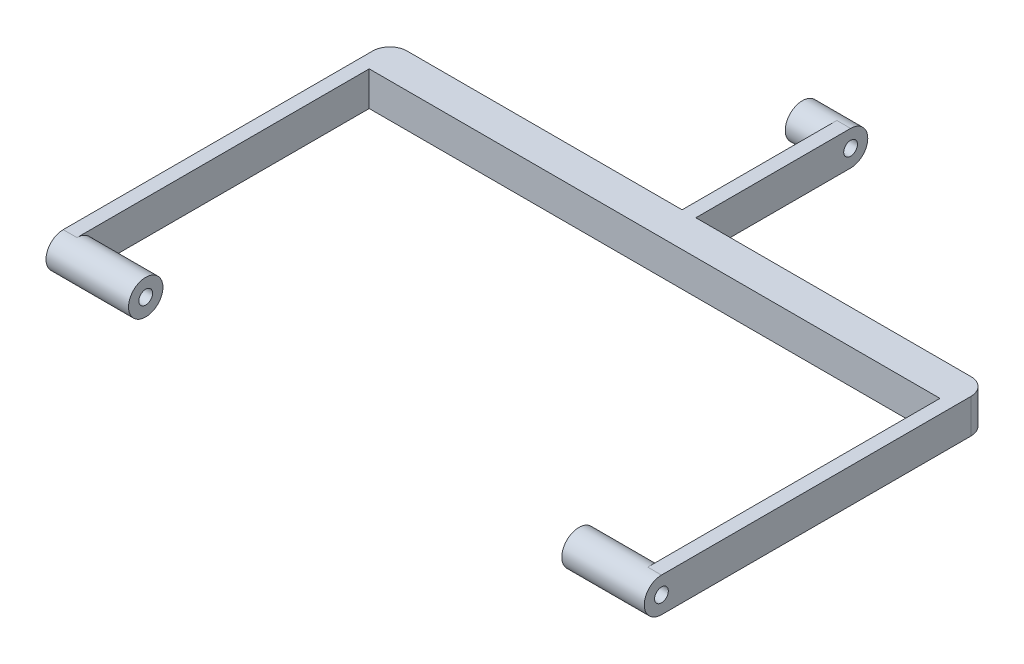
ISO-10303-21;
HEADER;
FILE_DESCRIPTION(('STEP AP214'),'2;1');
FILE_NAME('part.step','',(''),(''),'','','');
FILE_SCHEMA(('AUTOMOTIVE_DESIGN { 1 0 10303 214 1 1 1 1 }'));
ENDSEC;
DATA;
#1=APPLICATION_CONTEXT('core data for automotive mechanical design processes');
#2=APPLICATION_PROTOCOL_DEFINITION('international standard','automotive_design',2000,#1);
#3=PRODUCT_CONTEXT('',#1,'mechanical');
#4=PRODUCT('Part','Part','',(#3));
#5=PRODUCT_RELATED_PRODUCT_CATEGORY('part','',(#4));
#6=PRODUCT_DEFINITION_FORMATION('','',#4);
#7=PRODUCT_DEFINITION_CONTEXT('part definition',#1,'design');
#8=PRODUCT_DEFINITION('design','',#6,#7);
#9=PRODUCT_DEFINITION_SHAPE('','',#8);
#10=(LENGTH_UNIT() NAMED_UNIT(*) SI_UNIT(.MILLI.,.METRE.));
#11=(NAMED_UNIT(*) PLANE_ANGLE_UNIT() SI_UNIT($,.RADIAN.));
#12=(NAMED_UNIT(*) SI_UNIT($,.STERADIAN.) SOLID_ANGLE_UNIT());
#13=UNCERTAINTY_MEASURE_WITH_UNIT(LENGTH_MEASURE(1.E-05),#10,'distance_accuracy_value','');
#14=(GEOMETRIC_REPRESENTATION_CONTEXT(3) GLOBAL_UNCERTAINTY_ASSIGNED_CONTEXT((#13)) GLOBAL_UNIT_ASSIGNED_CONTEXT((#10,
#11,#12)) REPRESENTATION_CONTEXT('',''));
#15=CARTESIAN_POINT('',(0.,0.,0.));
#16=DIRECTION('',(0.,0.,1.));
#17=DIRECTION('',(1.,0.,0.));
#18=AXIS2_PLACEMENT_3D('',#15,#16,#17);
#19=CARTESIAN_POINT('',(-1.,0.,0.));
#20=DIRECTION('',(1.,0.,0.));
#21=DIRECTION('',(0.,0.,-1.));
#22=AXIS2_PLACEMENT_3D('',#19,#20,#21);
#23=PLANE('',#22);
#24=CARTESIAN_POINT('',(-1.,2.5,-25.));
#25=DIRECTION('',(-1.,0.,0.));
#26=DIRECTION('',(0.,0.,1.));
#27=AXIS2_PLACEMENT_3D('',#24,#25,#26);
#28=CIRCLE('',#27,2.5);
#29=CARTESIAN_POINT('',(-1.,0.,-25.));
#30=VERTEX_POINT('',#29);
#31=CARTESIAN_POINT('',(-1.,5.,-25.));
#32=VERTEX_POINT('',#31);
#33=EDGE_CURVE('E155',#30,#32,#28,.T.);
#34=ORIENTED_EDGE('',*,*,#33,.F.);
#35=DIRECTION('',(0.,0.,-1.));
#36=VECTOR('',#35,1.);
#37=CARTESIAN_POINT('',(-1.,0.,2.5));
#38=LINE('',#37,#36);
#39=CARTESIAN_POINT('',(-1.,0.,-2.5));
#40=VERTEX_POINT('',#39);
#41=EDGE_CURVE('E163',#40,#30,#38,.T.);
#42=ORIENTED_EDGE('',*,*,#41,.F.);
#43=DIRECTION('',(0.,1.,0.));
#44=VECTOR('',#43,1.);
#45=CARTESIAN_POINT('',(-1.,5.,-2.5));
#46=LINE('',#45,#44);
#47=CARTESIAN_POINT('',(-1.,5.,-2.5));
#48=VERTEX_POINT('',#47);
#49=EDGE_CURVE('E184',#40,#48,#46,.T.);
#50=ORIENTED_EDGE('',*,*,#49,.T.);
#51=DIRECTION('',(0.,0.,1.));
#52=VECTOR('',#51,1.);
#53=CARTESIAN_POINT('',(-1.,5.,2.5));
#54=LINE('',#53,#52);
#55=EDGE_CURVE('E169',#32,#48,#54,.T.);
#56=ORIENTED_EDGE('',*,*,#55,.F.);
#57=EDGE_LOOP('',(#34,#42,#50,#56));
#58=FACE_BOUND('',#57,.T.);
#59=ADVANCED_FACE('F33',(#58),#23,.F.);
#60=CARTESIAN_POINT('',(-43.5,5.,-2.5));
#61=DIRECTION('',(0.,0.,1.));
#62=DIRECTION('',(1.,0.,0.));
#63=AXIS2_PLACEMENT_3D('',#60,#61,#62);
#64=PLANE('',#63);
#65=ORIENTED_EDGE('',*,*,#49,.F.);
#66=DIRECTION('',(-1.,0.,0.));
#67=VECTOR('',#66,1.);
#68=CARTESIAN_POINT('',(-43.5,0.,-2.5));
#69=LINE('',#68,#67);
#70=CARTESIAN_POINT('',(-41.,0.,-2.5));
#71=VERTEX_POINT('',#70);
#72=EDGE_CURVE('E166',#40,#71,#69,.T.);
#73=ORIENTED_EDGE('',*,*,#72,.T.);
#74=DIRECTION('',(0.,-1.,0.));
#75=VECTOR('',#74,1.);
#76=CARTESIAN_POINT('',(-41.,5.,-2.5));
#77=LINE('',#76,#75);
#78=CARTESIAN_POINT('',(-41.,5.,-2.5));
#79=VERTEX_POINT('',#78);
#80=EDGE_CURVE('E272',#71,#79,#77,.F.);
#81=ORIENTED_EDGE('',*,*,#80,.T.);
#82=DIRECTION('',(-1.,0.,0.));
#83=VECTOR('',#82,1.);
#84=CARTESIAN_POINT('',(-43.5,5.,-2.5));
#85=LINE('',#84,#83);
#86=EDGE_CURVE('E236',#48,#79,#85,.T.);
#87=ORIENTED_EDGE('',*,*,#86,.F.);
#88=EDGE_LOOP('',(#65,#73,#81,#87));
#89=FACE_BOUND('',#88,.T.);
#90=ADVANCED_FACE('F350',(#89),#64,.F.);
#91=CARTESIAN_POINT('',(-41.5,5.,-2.5));
#92=DIRECTION('',(-1.,0.,0.));
#93=DIRECTION('',(0.,0.,1.));
#94=AXIS2_PLACEMENT_3D('',#91,#92,#93);
#95=PLANE('',#94);
#96=CARTESIAN_POINT('',(-41.5,2.5,45.));
#97=DIRECTION('',(1.,0.,0.));
#98=DIRECTION('',(0.,0.,-1.));
#99=AXIS2_PLACEMENT_3D('',#96,#97,#98);
#100=CIRCLE('',#99,2.5);
#101=CARTESIAN_POINT('',(-41.5,0.,45.));
#102=VERTEX_POINT('',#101);
#103=CARTESIAN_POINT('',(-41.5,5.,45.));
#104=VERTEX_POINT('',#103);
#105=EDGE_CURVE('E216',#102,#104,#100,.T.);
#106=ORIENTED_EDGE('',*,*,#105,.F.);
#107=DIRECTION('',(0.,0.,-1.));
#108=VECTOR('',#107,1.);
#109=CARTESIAN_POINT('',(-41.5,0.,-2.5));
#110=LINE('',#109,#108);
#111=CARTESIAN_POINT('',(-41.5,0.,2.5));
#112=VERTEX_POINT('',#111);
#113=EDGE_CURVE('E228',#102,#112,#110,.T.);
#114=ORIENTED_EDGE('',*,*,#113,.T.);
#115=DIRECTION('',(0.,1.,0.));
#116=VECTOR('',#115,1.);
#117=CARTESIAN_POINT('',(-41.5,5.,2.5));
#118=LINE('',#117,#116);
#119=CARTESIAN_POINT('',(-41.5,5.,2.5));
#120=VERTEX_POINT('',#119);
#121=EDGE_CURVE('E227',#112,#120,#118,.T.);
#122=ORIENTED_EDGE('',*,*,#121,.T.);
#123=DIRECTION('',(0.,0.,-1.));
#124=VECTOR('',#123,1.);
#125=CARTESIAN_POINT('',(-41.5,5.,-2.5));
#126=LINE('',#125,#124);
#127=EDGE_CURVE('E225',#104,#120,#126,.T.);
#128=ORIENTED_EDGE('',*,*,#127,.F.);
#129=EDGE_LOOP('',(#106,#114,#122,#128));
#130=FACE_BOUND('',#129,.T.);
#131=ADVANCED_FACE('F334',(#130),#95,.F.);
#132=CARTESIAN_POINT('',(-43.5,5.,2.5));
#133=DIRECTION('',(0.,0.,-1.));
#134=DIRECTION('',(-1.,0.,0.));
#135=AXIS2_PLACEMENT_3D('',#132,#133,#134);
#136=PLANE('',#135);
#137=DIRECTION('',(0.,1.,0.));
#138=VECTOR('',#137,1.);
#139=CARTESIAN_POINT('',(41.5,5.,2.5));
#140=LINE('',#139,#138);
#141=CARTESIAN_POINT('',(41.5,0.,2.5));
#142=VERTEX_POINT('',#141);
#143=CARTESIAN_POINT('',(41.5,5.,2.5));
#144=VERTEX_POINT('',#143);
#145=EDGE_CURVE('E206',#142,#144,#140,.T.);
#146=ORIENTED_EDGE('',*,*,#145,.T.);
#147=DIRECTION('',(1.,0.,0.));
#148=VECTOR('',#147,1.);
#149=CARTESIAN_POINT('',(-43.5,5.,2.5));
#150=LINE('',#149,#148);
#151=EDGE_CURVE('E243',#120,#144,#150,.T.);
#152=ORIENTED_EDGE('',*,*,#151,.F.);
#153=ORIENTED_EDGE('',*,*,#121,.F.);
#154=DIRECTION('',(1.,0.,0.));
#155=VECTOR('',#154,1.);
#156=CARTESIAN_POINT('',(-43.5,0.,2.5));
#157=LINE('',#156,#155);
#158=EDGE_CURVE('E237',#112,#142,#157,.T.);
#159=ORIENTED_EDGE('',*,*,#158,.T.);
#160=EDGE_LOOP('',(#146,#152,#153,#159));
#161=FACE_BOUND('',#160,.T.);
#162=ADVANCED_FACE('F327',(#161),#136,.F.);
#163=CARTESIAN_POINT('',(43.5,5.,2.5));
#164=DIRECTION('',(-1.,0.,0.));
#165=DIRECTION('',(0.,0.,1.));
#166=AXIS2_PLACEMENT_3D('',#163,#164,#165);
#167=PLANE('',#166);
#168=CARTESIAN_POINT('',(43.5,2.5,45.));
#169=DIRECTION('',(1.,0.,0.));
#170=DIRECTION('',(0.,0.,-1.));
#171=AXIS2_PLACEMENT_3D('',#168,#169,#170);
#172=CIRCLE('',#171,0.999999999999998);
#173=CARTESIAN_POINT('',(43.5,2.5,44.));
#174=VERTEX_POINT('',#173);
#175=EDGE_CURVE('E192',#174,#174,#172,.T.);
#176=ORIENTED_EDGE('',*,*,#175,.F.);
#177=EDGE_LOOP('',(#176));
#178=FACE_BOUND('',#177,.T.);
#179=DIRECTION('',(0.,0.,-1.));
#180=VECTOR('',#179,1.);
#181=CARTESIAN_POINT('',(43.5,0.,2.5));
#182=LINE('',#181,#180);
#183=CARTESIAN_POINT('',(43.5,0.,45.));
#184=VERTEX_POINT('',#183);
#185=CARTESIAN_POINT('',(43.5,0.,0.));
#186=VERTEX_POINT('',#185);
#187=EDGE_CURVE('E232',#184,#186,#182,.T.);
#188=ORIENTED_EDGE('',*,*,#187,.T.);
#189=DIRECTION('',(0.,-1.,0.));
#190=VECTOR('',#189,1.);
#191=CARTESIAN_POINT('',(43.5,5.,0.));
#192=LINE('',#191,#190);
#193=CARTESIAN_POINT('',(43.5,5.,0.));
#194=VERTEX_POINT('',#193);
#195=EDGE_CURVE('E283',#186,#194,#192,.F.);
#196=ORIENTED_EDGE('',*,*,#195,.T.);
#197=DIRECTION('',(0.,0.,-1.));
#198=VECTOR('',#197,1.);
#199=CARTESIAN_POINT('',(43.5,5.,2.5));
#200=LINE('',#199,#198);
#201=CARTESIAN_POINT('',(43.5,5.,45.));
#202=VERTEX_POINT('',#201);
#203=EDGE_CURVE('E233',#202,#194,#200,.T.);
#204=ORIENTED_EDGE('',*,*,#203,.F.);
#205=CARTESIAN_POINT('',(43.5,2.5,45.));
#206=DIRECTION('',(-1.,0.,0.));
#207=DIRECTION('',(0.,0.,1.));
#208=AXIS2_PLACEMENT_3D('',#205,#206,#207);
#209=CIRCLE('',#208,2.5);
#210=CARTESIAN_POINT('',(43.5,2.5,47.5));
#211=VERTEX_POINT('',#210);
#212=EDGE_CURVE('E266',#202,#211,#209,.F.);
#213=ORIENTED_EDGE('',*,*,#212,.T.);
#214=CARTESIAN_POINT('',(43.5,2.5,45.));
#215=DIRECTION('',(-1.,0.,0.));
#216=DIRECTION('',(0.,0.,1.));
#217=AXIS2_PLACEMENT_3D('',#214,#215,#216);
#218=CIRCLE('',#217,2.5);
#219=EDGE_CURVE('E268',#211,#184,#218,.F.);
#220=ORIENTED_EDGE('',*,*,#219,.T.);
#221=EDGE_LOOP('',(#188,#196,#204,#213,#220));
#222=FACE_BOUND('',#221,.T.);
#223=ADVANCED_FACE('F307',(#178,#222),#167,.F.);
#224=CARTESIAN_POINT('',(41.,0.,-2.5));
#225=VERTEX_POINT('',#224);
#226=CARTESIAN_POINT('',(1.,0.,-2.5));
#227=VERTEX_POINT('',#226);
#228=EDGE_CURVE('E248',#225,#227,#69,.T.);
#229=ORIENTED_EDGE('',*,*,#228,.T.);
#230=DIRECTION('',(0.,1.,0.));
#231=VECTOR('',#230,1.);
#232=CARTESIAN_POINT('',(1.,5.,-2.5));
#233=LINE('',#232,#231);
#234=CARTESIAN_POINT('',(1.,5.,-2.5));
#235=VERTEX_POINT('',#234);
#236=EDGE_CURVE('E188',#227,#235,#233,.T.);
#237=ORIENTED_EDGE('',*,*,#236,.T.);
#238=CARTESIAN_POINT('',(41.,5.,-2.5));
#239=VERTEX_POINT('',#238);
#240=EDGE_CURVE('E238',#239,#235,#85,.T.);
#241=ORIENTED_EDGE('',*,*,#240,.F.);
#242=DIRECTION('',(0.,-1.,0.));
#243=VECTOR('',#242,1.);
#244=CARTESIAN_POINT('',(41.,5.,-2.5));
#245=LINE('',#244,#243);
#246=EDGE_CURVE('E276',#239,#225,#245,.T.);
#247=ORIENTED_EDGE('',*,*,#246,.T.);
#248=EDGE_LOOP('',(#229,#237,#241,#247));
#249=FACE_BOUND('',#248,.T.);
#250=ADVANCED_FACE('F299',(#249),#64,.F.);
#251=CARTESIAN_POINT('',(-43.5,5.,2.5));
#252=DIRECTION('',(1.,0.,0.));
#253=DIRECTION('',(0.,0.,-1.));
#254=AXIS2_PLACEMENT_3D('',#251,#252,#253);
#255=PLANE('',#254);
#256=CARTESIAN_POINT('',(-43.5,2.5,45.));
#257=DIRECTION('',(1.,0.,0.));
#258=DIRECTION('',(0.,0.,-1.));
#259=AXIS2_PLACEMENT_3D('',#256,#257,#258);
#260=CIRCLE('',#259,0.999999999999998);
#261=CARTESIAN_POINT('',(-43.5,2.5,44.));
#262=VERTEX_POINT('',#261);
#263=EDGE_CURVE('E213',#262,#262,#260,.T.);
#264=ORIENTED_EDGE('',*,*,#263,.T.);
#265=EDGE_LOOP('',(#264));
#266=FACE_BOUND('',#265,.T.);
#267=DIRECTION('',(0.,0.,1.));
#268=VECTOR('',#267,1.);
#269=CARTESIAN_POINT('',(-43.5,5.,2.5));
#270=LINE('',#269,#268);
#271=CARTESIAN_POINT('',(-43.5,5.,0.));
#272=VERTEX_POINT('',#271);
#273=CARTESIAN_POINT('',(-43.5,5.,45.));
#274=VERTEX_POINT('',#273);
#275=EDGE_CURVE('E241',#272,#274,#270,.T.);
#276=ORIENTED_EDGE('',*,*,#275,.F.);
#277=DIRECTION('',(0.,-1.,0.));
#278=VECTOR('',#277,1.);
#279=CARTESIAN_POINT('',(-43.5,5.,0.));
#280=LINE('',#279,#278);
#281=CARTESIAN_POINT('',(-43.5,0.,0.));
#282=VERTEX_POINT('',#281);
#283=EDGE_CURVE('E159',#272,#282,#280,.T.);
#284=ORIENTED_EDGE('',*,*,#283,.T.);
#285=DIRECTION('',(0.,0.,1.));
#286=VECTOR('',#285,1.);
#287=CARTESIAN_POINT('',(-43.5,0.,2.5));
#288=LINE('',#287,#286);
#289=CARTESIAN_POINT('',(-43.5,0.,45.));
#290=VERTEX_POINT('',#289);
#291=EDGE_CURVE('E250',#282,#290,#288,.T.);
#292=ORIENTED_EDGE('',*,*,#291,.T.);
#293=CARTESIAN_POINT('',(-43.5,2.5,45.));
#294=DIRECTION('',(1.,0.,0.));
#295=DIRECTION('',(0.,0.,-1.));
#296=AXIS2_PLACEMENT_3D('',#293,#294,#295);
#297=CIRCLE('',#296,2.5);
#298=CARTESIAN_POINT('',(-43.5,2.5,47.5));
#299=VERTEX_POINT('',#298);
#300=EDGE_CURVE('E258',#290,#299,#297,.F.);
#301=ORIENTED_EDGE('',*,*,#300,.T.);
#302=CARTESIAN_POINT('',(-43.5,2.5,45.));
#303=DIRECTION('',(1.,0.,0.));
#304=DIRECTION('',(0.,0.,-1.));
#305=AXIS2_PLACEMENT_3D('',#302,#303,#304);
#306=CIRCLE('',#305,2.5);
#307=EDGE_CURVE('E255',#299,#274,#306,.F.);
#308=ORIENTED_EDGE('',*,*,#307,.T.);
#309=EDGE_LOOP('',(#276,#284,#292,#301,#308));
#310=FACE_BOUND('',#309,.T.);
#311=ADVANCED_FACE('F343',(#266,#310),#255,.F.);
#312=CARTESIAN_POINT('',(0.,5.,0.));
#313=DIRECTION('',(0.,-1.,0.));
#314=DIRECTION('',(0.,0.,-1.));
#315=AXIS2_PLACEMENT_3D('',#312,#313,#314);
#316=PLANE('',#315);
#317=DIRECTION('',(0.,0.,1.));
#318=VECTOR('',#317,1.);
#319=CARTESIAN_POINT('',(1.,5.,2.5));
#320=LINE('',#319,#318);
#321=CARTESIAN_POINT('',(1.,5.,-25.));
#322=VERTEX_POINT('',#321);
#323=EDGE_CURVE('E183',#322,#235,#320,.T.);
#324=ORIENTED_EDGE('',*,*,#323,.F.);
#325=DIRECTION('',(-1.,0.,0.));
#326=VECTOR('',#325,1.);
#327=CARTESIAN_POINT('',(0.,5.,-25.));
#328=LINE('',#327,#326);
#329=EDGE_CURVE('E11',#322,#32,#328,.T.);
#330=ORIENTED_EDGE('',*,*,#329,.T.);
#331=ORIENTED_EDGE('',*,*,#55,.T.);
#332=ORIENTED_EDGE('',*,*,#86,.T.);
#333=CARTESIAN_POINT('',(-41.,5.,0.));
#334=DIRECTION('',(0.,-1.,0.));
#335=DIRECTION('',(0.,0.,-1.));
#336=AXIS2_PLACEMENT_3D('',#333,#334,#335);
#337=CIRCLE('',#336,2.5);
#338=EDGE_CURVE('E285',#79,#272,#337,.F.);
#339=ORIENTED_EDGE('',*,*,#338,.T.);
#340=ORIENTED_EDGE('',*,*,#275,.T.);
#341=DIRECTION('',(1.,0.,0.));
#342=VECTOR('',#341,1.);
#343=CARTESIAN_POINT('',(0.,5.,45.));
#344=LINE('',#343,#342);
#345=EDGE_CURVE('E260',#274,#104,#344,.T.);
#346=ORIENTED_EDGE('',*,*,#345,.T.);
#347=ORIENTED_EDGE('',*,*,#127,.T.);
#348=ORIENTED_EDGE('',*,*,#151,.T.);
#349=DIRECTION('',(0.,0.,-1.));
#350=VECTOR('',#349,1.);
#351=CARTESIAN_POINT('',(41.5,5.,-2.5));
#352=LINE('',#351,#350);
#353=CARTESIAN_POINT('',(41.5,5.,45.));
#354=VERTEX_POINT('',#353);
#355=EDGE_CURVE('E203',#354,#144,#352,.T.);
#356=ORIENTED_EDGE('',*,*,#355,.F.);
#357=DIRECTION('',(-1.,0.,0.));
#358=VECTOR('',#357,1.);
#359=CARTESIAN_POINT('',(43.5,5.,45.));
#360=LINE('',#359,#358);
#361=EDGE_CURVE('E270',#354,#202,#360,.F.);
#362=ORIENTED_EDGE('',*,*,#361,.T.);
#363=ORIENTED_EDGE('',*,*,#203,.T.);
#364=CARTESIAN_POINT('',(41.,5.,0.));
#365=DIRECTION('',(0.,-1.,0.));
#366=DIRECTION('',(0.,0.,-1.));
#367=AXIS2_PLACEMENT_3D('',#364,#365,#366);
#368=CIRCLE('',#367,2.5);
#369=EDGE_CURVE('E287',#194,#239,#368,.F.);
#370=ORIENTED_EDGE('',*,*,#369,.T.);
#371=ORIENTED_EDGE('',*,*,#240,.T.);
#372=EDGE_LOOP('',(#324,#330,#331,#332,#339,#340,#346,#347,#348,#356,#362,#363,#370,#371));
#373=FACE_BOUND('',#372,.T.);
#374=ADVANCED_FACE('F293',(#373),#316,.F.);
#375=CARTESIAN_POINT('',(0.,0.,0.));
#376=DIRECTION('',(0.,-1.,0.));
#377=DIRECTION('',(0.,0.,-1.));
#378=AXIS2_PLACEMENT_3D('',#375,#376,#377);
#379=PLANE('',#378);
#380=ORIENTED_EDGE('',*,*,#41,.T.);
#381=DIRECTION('',(-1.,0.,0.));
#382=VECTOR('',#381,1.);
#383=CARTESIAN_POINT('',(1.,0.,-25.));
#384=LINE('',#383,#382);
#385=CARTESIAN_POINT('',(1.,0.,-25.));
#386=VERTEX_POINT('',#385);
#387=EDGE_CURVE('E150',#30,#386,#384,.F.);
#388=ORIENTED_EDGE('',*,*,#387,.T.);
#389=DIRECTION('',(0.,0.,-1.));
#390=VECTOR('',#389,1.);
#391=CARTESIAN_POINT('',(1.,0.,2.5));
#392=LINE('',#391,#390);
#393=EDGE_CURVE('E181',#227,#386,#392,.T.);
#394=ORIENTED_EDGE('',*,*,#393,.F.);
#395=ORIENTED_EDGE('',*,*,#228,.F.);
#396=CARTESIAN_POINT('',(41.,0.,0.));
#397=DIRECTION('',(0.,-1.,0.));
#398=DIRECTION('',(0.,0.,-1.));
#399=AXIS2_PLACEMENT_3D('',#396,#397,#398);
#400=CIRCLE('',#399,2.5);
#401=EDGE_CURVE('E281',#225,#186,#400,.T.);
#402=ORIENTED_EDGE('',*,*,#401,.T.);
#403=ORIENTED_EDGE('',*,*,#187,.F.);
#404=DIRECTION('',(-1.,0.,0.));
#405=VECTOR('',#404,1.);
#406=CARTESIAN_POINT('',(0.,0.,45.));
#407=LINE('',#406,#405);
#408=CARTESIAN_POINT('',(41.5,0.,45.));
#409=VERTEX_POINT('',#408);
#410=EDGE_CURVE('E262',#184,#409,#407,.T.);
#411=ORIENTED_EDGE('',*,*,#410,.T.);
#412=DIRECTION('',(0.,0.,-1.));
#413=VECTOR('',#412,1.);
#414=CARTESIAN_POINT('',(41.5,0.,-2.5));
#415=LINE('',#414,#413);
#416=EDGE_CURVE('E207',#409,#142,#415,.T.);
#417=ORIENTED_EDGE('',*,*,#416,.T.);
#418=ORIENTED_EDGE('',*,*,#158,.F.);
#419=ORIENTED_EDGE('',*,*,#113,.F.);
#420=DIRECTION('',(1.,0.,0.));
#421=VECTOR('',#420,1.);
#422=CARTESIAN_POINT('',(-43.5,0.,45.));
#423=LINE('',#422,#421);
#424=EDGE_CURVE('E245',#102,#290,#423,.F.);
#425=ORIENTED_EDGE('',*,*,#424,.T.);
#426=ORIENTED_EDGE('',*,*,#291,.F.);
#427=CARTESIAN_POINT('',(-41.,0.,0.));
#428=DIRECTION('',(0.,-1.,0.));
#429=DIRECTION('',(0.,0.,-1.));
#430=AXIS2_PLACEMENT_3D('',#427,#428,#429);
#431=CIRCLE('',#430,2.5);
#432=EDGE_CURVE('E279',#282,#71,#431,.T.);
#433=ORIENTED_EDGE('',*,*,#432,.T.);
#434=ORIENTED_EDGE('',*,*,#72,.F.);
#435=EDGE_LOOP('',(#380,#388,#394,#395,#402,#403,#411,#417,#418,#419,#425,#426,#433,#434));
#436=FACE_BOUND('',#435,.T.);
#437=ADVANCED_FACE('F164',(#436),#379,.T.);
#438=CARTESIAN_POINT('',(0.,2.5,45.));
#439=DIRECTION('',(1.,0.,0.));
#440=DIRECTION('',(0.,0.,-1.));
#441=AXIS2_PLACEMENT_3D('',#438,#439,#440);
#442=CYLINDRICAL_SURFACE('',#441,2.5);
#443=ORIENTED_EDGE('',*,*,#345,.F.);
#444=ORIENTED_EDGE('',*,*,#307,.F.);
#445=DIRECTION('',(1.,0.,0.));
#446=VECTOR('',#445,1.);
#447=CARTESIAN_POINT('',(-43.5,2.5,47.5));
#448=LINE('',#447,#446);
#449=CARTESIAN_POINT('',(-41.5,2.5,47.5));
#450=VERTEX_POINT('',#449);
#451=EDGE_CURVE('E222',#450,#299,#448,.F.);
#452=ORIENTED_EDGE('',*,*,#451,.F.);
#453=ORIENTED_EDGE('',*,*,#451,.T.);
#454=ORIENTED_EDGE('',*,*,#300,.F.);
#455=ORIENTED_EDGE('',*,*,#424,.F.);
#456=ORIENTED_EDGE('',*,*,#105,.T.);
#457=EDGE_LOOP('',(#443,#444,#452,#453,#454,#455,#456));
#458=FACE_BOUND('',#457,.T.);
#459=CARTESIAN_POINT('',(-31.5,2.5,45.));
#460=DIRECTION('',(1.,0.,0.));
#461=DIRECTION('',(0.,0.,-1.));
#462=AXIS2_PLACEMENT_3D('',#459,#460,#461);
#463=CIRCLE('',#462,2.5);
#464=CARTESIAN_POINT('',(-31.5,2.5,42.5));
#465=VERTEX_POINT('',#464);
#466=EDGE_CURVE('E219',#465,#465,#463,.T.);
#467=ORIENTED_EDGE('',*,*,#466,.F.);
#468=EDGE_LOOP('',(#467));
#469=FACE_BOUND('',#468,.T.);
#470=ADVANCED_FACE('F337',(#458,#469),#442,.T.);
#471=CARTESIAN_POINT('',(-31.5,2.5,45.));
#472=DIRECTION('',(1.,0.,0.));
#473=DIRECTION('',(0.,0.,-1.));
#474=AXIS2_PLACEMENT_3D('',#471,#472,#473);
#475=PLANE('',#474);
#476=CARTESIAN_POINT('',(-31.5,2.5,45.));
#477=DIRECTION('',(1.,0.,0.));
#478=DIRECTION('',(0.,0.,-1.));
#479=AXIS2_PLACEMENT_3D('',#476,#477,#478);
#480=CIRCLE('',#479,0.999999999999998);
#481=CARTESIAN_POINT('',(-31.5,2.5,44.));
#482=VERTEX_POINT('',#481);
#483=EDGE_CURVE('E212',#482,#482,#480,.T.);
#484=ORIENTED_EDGE('',*,*,#483,.F.);
#485=EDGE_LOOP('',(#484));
#486=FACE_BOUND('',#485,.T.);
#487=ORIENTED_EDGE('',*,*,#466,.T.);
#488=EDGE_LOOP('',(#487));
#489=FACE_BOUND('',#488,.T.);
#490=ADVANCED_FACE('F376',(#486,#489),#475,.T.);
#491=CARTESIAN_POINT('',(-43.5,2.5,45.));
#492=DIRECTION('',(1.,0.,0.));
#493=DIRECTION('',(0.,0.,-1.));
#494=AXIS2_PLACEMENT_3D('',#491,#492,#493);
#495=CYLINDRICAL_SURFACE('',#494,0.999999999999998);
#496=ORIENTED_EDGE('',*,*,#263,.F.);
#497=EDGE_LOOP('',(#496));
#498=FACE_BOUND('',#497,.T.);
#499=ORIENTED_EDGE('',*,*,#483,.T.);
#500=EDGE_LOOP('',(#499));
#501=FACE_BOUND('',#500,.T.);
#502=ADVANCED_FACE('F404',(#498,#501),#495,.F.);
#503=CARTESIAN_POINT('',(41.5,5.,-2.5));
#504=DIRECTION('',(-1.,0.,0.));
#505=DIRECTION('',(0.,0.,1.));
#506=AXIS2_PLACEMENT_3D('',#503,#504,#505);
#507=PLANE('',#506);
#508=CARTESIAN_POINT('',(41.5,2.5,45.));
#509=DIRECTION('',(1.,0.,0.));
#510=DIRECTION('',(0.,0.,-1.));
#511=AXIS2_PLACEMENT_3D('',#508,#509,#510);
#512=CIRCLE('',#511,2.5);
#513=EDGE_CURVE('E195',#409,#354,#512,.T.);
#514=ORIENTED_EDGE('',*,*,#513,.T.);
#515=ORIENTED_EDGE('',*,*,#355,.T.);
#516=ORIENTED_EDGE('',*,*,#145,.F.);
#517=ORIENTED_EDGE('',*,*,#416,.F.);
#518=EDGE_LOOP('',(#514,#515,#516,#517));
#519=FACE_BOUND('',#518,.T.);
#520=ADVANCED_FACE('F324',(#519),#507,.T.);
#521=CARTESIAN_POINT('',(43.5,2.5,45.));
#522=DIRECTION('',(1.,0.,0.));
#523=DIRECTION('',(0.,0.,-1.));
#524=AXIS2_PLACEMENT_3D('',#521,#522,#523);
#525=CYLINDRICAL_SURFACE('',#524,2.5);
#526=DIRECTION('',(-1.,0.,0.));
#527=VECTOR('',#526,1.);
#528=CARTESIAN_POINT('',(41.5,2.5,47.5));
#529=LINE('',#528,#527);
#530=CARTESIAN_POINT('',(41.5,2.5,47.5));
#531=VERTEX_POINT('',#530);
#532=EDGE_CURVE('E201',#211,#531,#529,.T.);
#533=ORIENTED_EDGE('',*,*,#532,.F.);
#534=ORIENTED_EDGE('',*,*,#212,.F.);
#535=ORIENTED_EDGE('',*,*,#361,.F.);
#536=ORIENTED_EDGE('',*,*,#513,.F.);
#537=ORIENTED_EDGE('',*,*,#410,.F.);
#538=ORIENTED_EDGE('',*,*,#219,.F.);
#539=ORIENTED_EDGE('',*,*,#532,.T.);
#540=EDGE_LOOP('',(#533,#534,#535,#536,#537,#538,#539));
#541=FACE_BOUND('',#540,.T.);
#542=CARTESIAN_POINT('',(31.5,2.5,45.));
#543=DIRECTION('',(1.,0.,0.));
#544=DIRECTION('',(0.,0.,-1.));
#545=AXIS2_PLACEMENT_3D('',#542,#543,#544);
#546=CIRCLE('',#545,2.5);
#547=CARTESIAN_POINT('',(31.5,2.5,42.5));
#548=VERTEX_POINT('',#547);
#549=EDGE_CURVE('E198',#548,#548,#546,.T.);
#550=ORIENTED_EDGE('',*,*,#549,.T.);
#551=EDGE_LOOP('',(#550));
#552=FACE_BOUND('',#551,.T.);
#553=ADVANCED_FACE('F317',(#541,#552),#525,.T.);
#554=CARTESIAN_POINT('',(31.5,2.5,45.));
#555=DIRECTION('',(-1.,0.,0.));
#556=DIRECTION('',(0.,0.,-1.));
#557=AXIS2_PLACEMENT_3D('',#554,#555,#556);
#558=PLANE('',#557);
#559=CARTESIAN_POINT('',(31.5,2.5,45.));
#560=DIRECTION('',(1.,0.,0.));
#561=DIRECTION('',(0.,0.,-1.));
#562=AXIS2_PLACEMENT_3D('',#559,#560,#561);
#563=CIRCLE('',#562,0.999999999999998);
#564=CARTESIAN_POINT('',(31.5,2.5,44.));
#565=VERTEX_POINT('',#564);
#566=EDGE_CURVE('E191',#565,#565,#563,.T.);
#567=ORIENTED_EDGE('',*,*,#566,.T.);
#568=EDGE_LOOP('',(#567));
#569=FACE_BOUND('',#568,.T.);
#570=ORIENTED_EDGE('',*,*,#549,.F.);
#571=EDGE_LOOP('',(#570));
#572=FACE_BOUND('',#571,.T.);
#573=ADVANCED_FACE('F379',(#569,#572),#558,.T.);
#574=CARTESIAN_POINT('',(43.5,2.5,45.));
#575=DIRECTION('',(-1.,0.,0.));
#576=DIRECTION('',(0.,0.,1.));
#577=AXIS2_PLACEMENT_3D('',#574,#575,#576);
#578=CYLINDRICAL_SURFACE('',#577,0.999999999999998);
#579=ORIENTED_EDGE('',*,*,#175,.T.);
#580=EDGE_LOOP('',(#579));
#581=FACE_BOUND('',#580,.T.);
#582=ORIENTED_EDGE('',*,*,#566,.F.);
#583=EDGE_LOOP('',(#582));
#584=FACE_BOUND('',#583,.T.);
#585=ADVANCED_FACE('F381',(#581,#584),#578,.F.);
#586=CARTESIAN_POINT('',(41.,5.,0.));
#587=DIRECTION('',(0.,-1.,0.));
#588=DIRECTION('',(0.,0.,-1.));
#589=AXIS2_PLACEMENT_3D('',#586,#587,#588);
#590=CYLINDRICAL_SURFACE('',#589,2.5);
#591=ORIENTED_EDGE('',*,*,#369,.F.);
#592=ORIENTED_EDGE('',*,*,#195,.F.);
#593=ORIENTED_EDGE('',*,*,#401,.F.);
#594=ORIENTED_EDGE('',*,*,#246,.F.);
#595=EDGE_LOOP('',(#591,#592,#593,#594));
#596=FACE_BOUND('',#595,.T.);
#597=ADVANCED_FACE('F311',(#596),#590,.T.);
#598=CARTESIAN_POINT('',(-41.,5.,0.));
#599=DIRECTION('',(0.,-1.,0.));
#600=DIRECTION('',(0.,0.,-1.));
#601=AXIS2_PLACEMENT_3D('',#598,#599,#600);
#602=CYLINDRICAL_SURFACE('',#601,2.5);
#603=ORIENTED_EDGE('',*,*,#338,.F.);
#604=ORIENTED_EDGE('',*,*,#80,.F.);
#605=ORIENTED_EDGE('',*,*,#432,.F.);
#606=ORIENTED_EDGE('',*,*,#283,.F.);
#607=EDGE_LOOP('',(#603,#604,#605,#606));
#608=FACE_BOUND('',#607,.T.);
#609=ADVANCED_FACE('F348',(#608),#602,.T.);
#610=CARTESIAN_POINT('',(1.,0.,0.));
#611=DIRECTION('',(1.,0.,0.));
#612=DIRECTION('',(0.,0.,-1.));
#613=AXIS2_PLACEMENT_3D('',#610,#611,#612);
#614=PLANE('',#613);
#615=CARTESIAN_POINT('',(1.,2.5,-25.));
#616=DIRECTION('',(1.,0.,0.));
#617=DIRECTION('',(0.,0.,-1.));
#618=AXIS2_PLACEMENT_3D('',#615,#616,#617);
#619=CIRCLE('',#618,1.00000000000001);
#620=CARTESIAN_POINT('',(1.,2.5,-26.));
#621=VERTEX_POINT('',#620);
#622=EDGE_CURVE('E174',#621,#621,#619,.T.);
#623=ORIENTED_EDGE('',*,*,#622,.F.);
#624=EDGE_LOOP('',(#623));
#625=FACE_BOUND('',#624,.T.);
#626=ORIENTED_EDGE('',*,*,#393,.T.);
#627=CARTESIAN_POINT('',(1.,2.5,-25.));
#628=DIRECTION('',(1.,0.,0.));
#629=DIRECTION('',(0.,0.,-1.));
#630=AXIS2_PLACEMENT_3D('',#627,#628,#629);
#631=CIRCLE('',#630,2.5);
#632=CARTESIAN_POINT('',(1.,2.5,-27.5));
#633=VERTEX_POINT('',#632);
#634=EDGE_CURVE('E42',#386,#633,#631,.T.);
#635=ORIENTED_EDGE('',*,*,#634,.T.);
#636=CARTESIAN_POINT('',(1.,2.5,-25.));
#637=DIRECTION('',(1.,0.,0.));
#638=DIRECTION('',(0.,0.,-1.));
#639=AXIS2_PLACEMENT_3D('',#636,#637,#638);
#640=CIRCLE('',#639,2.5);
#641=EDGE_CURVE('E50',#633,#322,#640,.T.);
#642=ORIENTED_EDGE('',*,*,#641,.T.);
#643=ORIENTED_EDGE('',*,*,#323,.T.);
#644=ORIENTED_EDGE('',*,*,#236,.F.);
#645=EDGE_LOOP('',(#626,#635,#642,#643,#644));
#646=FACE_BOUND('',#645,.T.);
#647=ADVANCED_FACE('F297',(#625,#646),#614,.T.);
#648=CARTESIAN_POINT('',(0.,2.5,-25.));
#649=DIRECTION('',(-1.,0.,0.));
#650=DIRECTION('',(0.,0.,1.));
#651=AXIS2_PLACEMENT_3D('',#648,#649,#650);
#652=CYLINDRICAL_SURFACE('',#651,2.5);
#653=ORIENTED_EDGE('',*,*,#329,.F.);
#654=ORIENTED_EDGE('',*,*,#641,.F.);
#655=DIRECTION('',(-1.,0.,0.));
#656=VECTOR('',#655,1.);
#657=CARTESIAN_POINT('',(1.,2.5,-27.5));
#658=LINE('',#657,#656);
#659=CARTESIAN_POINT('',(-1.,2.5,-27.5));
#660=VERTEX_POINT('',#659);
#661=EDGE_CURVE('E170',#660,#633,#658,.F.);
#662=ORIENTED_EDGE('',*,*,#661,.F.);
#663=ORIENTED_EDGE('',*,*,#661,.T.);
#664=ORIENTED_EDGE('',*,*,#634,.F.);
#665=ORIENTED_EDGE('',*,*,#387,.F.);
#666=ORIENTED_EDGE('',*,*,#33,.T.);
#667=EDGE_LOOP('',(#653,#654,#662,#663,#664,#665,#666));
#668=FACE_BOUND('',#667,.T.);
#669=CARTESIAN_POINT('',(-6.,2.5,-25.));
#670=DIRECTION('',(-1.,0.,0.));
#671=DIRECTION('',(0.,0.,1.));
#672=AXIS2_PLACEMENT_3D('',#669,#670,#671);
#673=CIRCLE('',#672,2.5);
#674=CARTESIAN_POINT('',(-6.,2.5,-22.5));
#675=VERTEX_POINT('',#674);
#676=EDGE_CURVE('E173',#675,#675,#673,.T.);
#677=ORIENTED_EDGE('',*,*,#676,.F.);
#678=EDGE_LOOP('',(#677));
#679=FACE_BOUND('',#678,.T.);
#680=ADVANCED_FACE('F35',(#668,#679),#652,.T.);
#681=CARTESIAN_POINT('',(-6.,2.5,-25.));
#682=DIRECTION('',(-1.,0.,0.));
#683=DIRECTION('',(0.,0.,1.));
#684=AXIS2_PLACEMENT_3D('',#681,#682,#683);
#685=PLANE('',#684);
#686=CARTESIAN_POINT('',(-6.,2.5,-25.));
#687=DIRECTION('',(-1.,0.,0.));
#688=DIRECTION('',(0.,0.,1.));
#689=AXIS2_PLACEMENT_3D('',#686,#687,#688);
#690=CIRCLE('',#689,1.00000000000001);
#691=CARTESIAN_POINT('',(-6.,2.5,-24.));
#692=VERTEX_POINT('',#691);
#693=EDGE_CURVE('E37',#692,#692,#690,.T.);
#694=ORIENTED_EDGE('',*,*,#693,.F.);
#695=EDGE_LOOP('',(#694));
#696=FACE_BOUND('',#695,.T.);
#697=ORIENTED_EDGE('',*,*,#676,.T.);
#698=EDGE_LOOP('',(#697));
#699=FACE_BOUND('',#698,.T.);
#700=ADVANCED_FACE('F391',(#696,#699),#685,.T.);
#701=CARTESIAN_POINT('',(-43.5,2.5,-25.));
#702=DIRECTION('',(1.,0.,0.));
#703=DIRECTION('',(0.,0.,-1.));
#704=AXIS2_PLACEMENT_3D('',#701,#702,#703);
#705=CYLINDRICAL_SURFACE('',#704,1.00000000000001);
#706=ORIENTED_EDGE('',*,*,#622,.T.);
#707=EDGE_LOOP('',(#706));
#708=FACE_BOUND('',#707,.T.);
#709=ORIENTED_EDGE('',*,*,#693,.T.);
#710=EDGE_LOOP('',(#709));
#711=FACE_BOUND('',#710,.T.);
#712=ADVANCED_FACE('F556',(#708,#711),#705,.F.);
#713=CLOSED_SHELL('',(#59,#90,#131,#162,#223,#250,#311,#374,#437,#470,#490,#502,#520,#553,#573,
#585,#597,#609,#647,#680,#700,#712));
#714=MANIFOLD_SOLID_BREP('B2',#713);
#715=ADVANCED_BREP_SHAPE_REPRESENTATION('',(#18,#714),#14);
#716=SHAPE_DEFINITION_REPRESENTATION(#9,#715);
ENDSEC;
END-ISO-10303-21;
